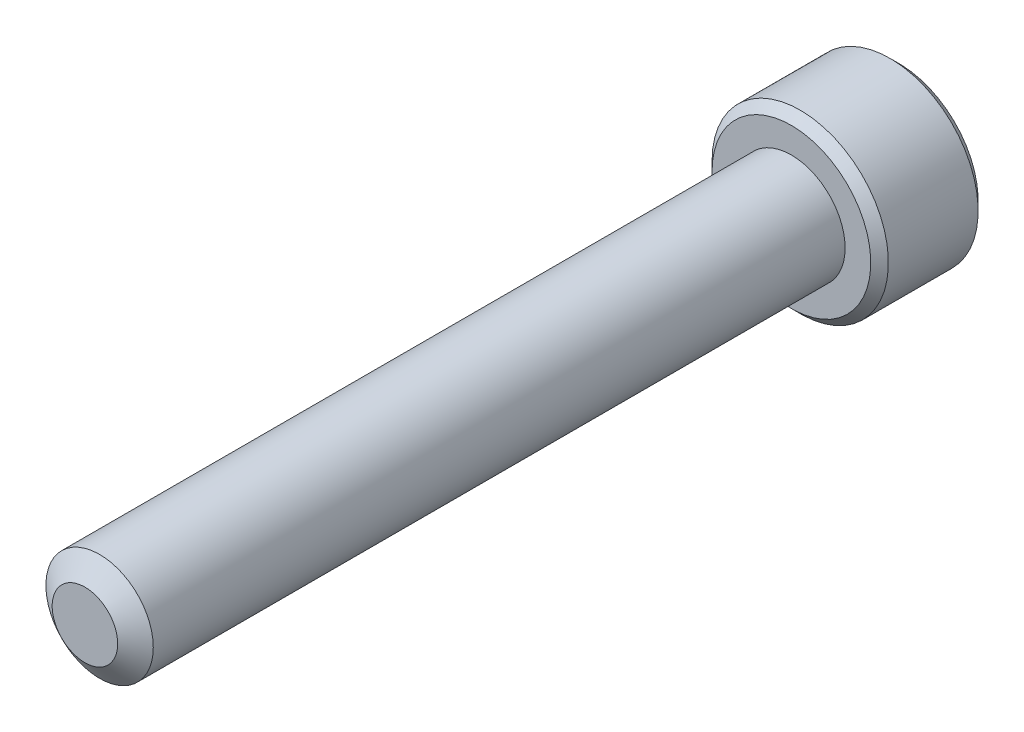
ISO-10303-21;
HEADER;
FILE_DESCRIPTION(('STEP AP214'),'2;1');
FILE_NAME('part.step','',(''),(''),'','','');
FILE_SCHEMA(('AUTOMOTIVE_DESIGN { 1 0 10303 214 1 1 1 1 }'));
ENDSEC;
DATA;
#1=APPLICATION_CONTEXT('core data for automotive mechanical design processes');
#2=APPLICATION_PROTOCOL_DEFINITION('international standard','automotive_design',2000,#1);
#3=PRODUCT_CONTEXT('',#1,'mechanical');
#4=PRODUCT('Part','Part','',(#3));
#5=PRODUCT_RELATED_PRODUCT_CATEGORY('part','',(#4));
#6=PRODUCT_DEFINITION_FORMATION('','',#4);
#7=PRODUCT_DEFINITION_CONTEXT('part definition',#1,'design');
#8=PRODUCT_DEFINITION('design','',#6,#7);
#9=PRODUCT_DEFINITION_SHAPE('','',#8);
#10=(LENGTH_UNIT() NAMED_UNIT(*) SI_UNIT(.MILLI.,.METRE.));
#11=(NAMED_UNIT(*) PLANE_ANGLE_UNIT() SI_UNIT($,.RADIAN.));
#12=(NAMED_UNIT(*) SI_UNIT($,.STERADIAN.) SOLID_ANGLE_UNIT());
#13=UNCERTAINTY_MEASURE_WITH_UNIT(LENGTH_MEASURE(1.E-05),#10,'distance_accuracy_value','');
#14=(GEOMETRIC_REPRESENTATION_CONTEXT(3) GLOBAL_UNCERTAINTY_ASSIGNED_CONTEXT((#13)) GLOBAL_UNIT_ASSIGNED_CONTEXT((#10,
#11,#12)) REPRESENTATION_CONTEXT('',''));
#15=CARTESIAN_POINT('',(0.,0.,0.));
#16=DIRECTION('',(0.,0.,1.));
#17=DIRECTION('',(1.,0.,0.));
#18=AXIS2_PLACEMENT_3D('',#15,#16,#17);
#19=CARTESIAN_POINT('',(0.,0.,-31.7500000000001));
#20=DIRECTION('',(0.,0.,1.));
#21=DIRECTION('',(1.,0.,0.));
#22=AXIS2_PLACEMENT_3D('',#19,#20,#21);
#23=CYLINDRICAL_SURFACE('',#22,2.413);
#24=CARTESIAN_POINT('',(0.,0.,-0.659180743038945));
#25=DIRECTION('',(0.,0.,1.));
#26=DIRECTION('',(1.,0.,0.));
#27=AXIS2_PLACEMENT_3D('',#24,#25,#26);
#28=CIRCLE('',#27,2.413);
#29=CARTESIAN_POINT('',(2.413,0.,-0.659180743038945));
#30=VERTEX_POINT('',#29);
#31=EDGE_CURVE('E114',#30,#30,#28,.T.);
#32=ORIENTED_EDGE('',*,*,#31,.F.);
#33=EDGE_LOOP('',(#32));
#34=FACE_BOUND('',#33,.T.);
#35=CARTESIAN_POINT('',(0.,0.,-31.7500000000001));
#36=DIRECTION('',(0.,0.,-1.));
#37=DIRECTION('',(-1.,0.,0.));
#38=AXIS2_PLACEMENT_3D('',#35,#36,#37);
#39=CIRCLE('',#38,2.413);
#40=CARTESIAN_POINT('',(-2.413,0.,-31.7500000000001));
#41=VERTEX_POINT('',#40);
#42=EDGE_CURVE('E220',#41,#41,#39,.F.);
#43=ORIENTED_EDGE('',*,*,#42,.T.);
#44=EDGE_LOOP('',(#43));
#45=FACE_BOUND('',#44,.T.);
#46=ADVANCED_FACE('F40',(#34,#45),#23,.T.);
#47=CARTESIAN_POINT('',(0.,0.,0.));
#48=DIRECTION('',(0.,0.,-1.));
#49=DIRECTION('',(-1.,0.,0.));
#50=AXIS2_PLACEMENT_3D('',#47,#48,#49);
#51=CONICAL_SURFACE('',#50,1.4715923357461,0.959931088596884);
#52=ORIENTED_EDGE('',*,*,#31,.T.);
#53=EDGE_LOOP('',(#52));
#54=FACE_BOUND('',#53,.T.);
#55=CARTESIAN_POINT('',(0.,0.,0.));
#56=DIRECTION('',(0.,0.,1.));
#57=DIRECTION('',(1.,0.,0.));
#58=AXIS2_PLACEMENT_3D('',#55,#56,#57);
#59=CIRCLE('',#58,1.4715923357461);
#60=CARTESIAN_POINT('',(1.4715923357461,0.,0.));
#61=VERTEX_POINT('',#60);
#62=EDGE_CURVE('E218',#61,#61,#59,.T.);
#63=ORIENTED_EDGE('',*,*,#62,.F.);
#64=EDGE_LOOP('',(#63));
#65=FACE_BOUND('',#64,.T.);
#66=ADVANCED_FACE('F201',(#54,#65),#51,.T.);
#67=CARTESIAN_POINT('',(0.,0.,0.));
#68=DIRECTION('',(0.,0.,1.));
#69=DIRECTION('',(1.,0.,0.));
#70=AXIS2_PLACEMENT_3D('',#67,#68,#69);
#71=PLANE('',#70);
#72=ORIENTED_EDGE('',*,*,#62,.T.);
#73=EDGE_LOOP('',(#72));
#74=FACE_BOUND('',#73,.T.);
#75=ADVANCED_FACE('F198',(#74),#71,.T.);
#76=CARTESIAN_POINT('',(0.,0.,-36.5760000000001));
#77=DIRECTION('',(0.,0.,1.));
#78=DIRECTION('',(1.,0.,0.));
#79=AXIS2_PLACEMENT_3D('',#76,#77,#78);
#80=CYLINDRICAL_SURFACE('',#79,3.9624);
#81=CARTESIAN_POINT('',(0.,0.,-36.17976));
#82=DIRECTION('',(0.,0.,-1.));
#83=DIRECTION('',(-1.,0.,0.));
#84=AXIS2_PLACEMENT_3D('',#81,#82,#83);
#85=CIRCLE('',#84,3.9624);
#86=CARTESIAN_POINT('',(-3.9624,0.,-36.17976));
#87=VERTEX_POINT('',#86);
#88=EDGE_CURVE('E48',#87,#87,#85,.F.);
#89=ORIENTED_EDGE('',*,*,#88,.T.);
#90=EDGE_LOOP('',(#89));
#91=FACE_BOUND('',#90,.T.);
#92=CARTESIAN_POINT('',(0.,0.,-32.14624));
#93=DIRECTION('',(0.,0.,-1.));
#94=DIRECTION('',(-1.,0.,0.));
#95=AXIS2_PLACEMENT_3D('',#92,#93,#94);
#96=CIRCLE('',#95,3.9624);
#97=CARTESIAN_POINT('',(-3.9624,0.,-32.14624));
#98=VERTEX_POINT('',#97);
#99=EDGE_CURVE('E177',#98,#98,#96,.T.);
#100=ORIENTED_EDGE('',*,*,#99,.T.);
#101=EDGE_LOOP('',(#100));
#102=FACE_BOUND('',#101,.T.);
#103=ADVANCED_FACE('F182',(#91,#102),#80,.T.);
#104=CARTESIAN_POINT('',(0.,0.,-36.5760000000001));
#105=DIRECTION('',(0.,0.,-1.));
#106=DIRECTION('',(-1.,0.,0.));
#107=AXIS2_PLACEMENT_3D('',#104,#105,#106);
#108=PLANE('',#107);
#109=CARTESIAN_POINT('',(0.,0.,-36.5760000000001));
#110=DIRECTION('',(0.,0.,-1.));
#111=DIRECTION('',(-1.,0.,0.));
#112=AXIS2_PLACEMENT_3D('',#109,#110,#111);
#113=CIRCLE('',#112,3.56616);
#114=CARTESIAN_POINT('',(-3.56616,0.,-36.5760000000001));
#115=VERTEX_POINT('',#114);
#116=EDGE_CURVE('E113',#115,#115,#113,.T.);
#117=ORIENTED_EDGE('',*,*,#116,.T.);
#118=EDGE_LOOP('',(#117));
#119=FACE_BOUND('',#118,.T.);
#120=CARTESIAN_POINT('',(0.,0.,-36.5760000000001));
#121=DIRECTION('',(0.,0.,-1.));
#122=DIRECTION('',(-1.,0.,0.));
#123=AXIS2_PLACEMENT_3D('',#120,#121,#122);
#124=CIRCLE('',#123,2.29135888084633);
#125=CARTESIAN_POINT('',(-1.98437499999999,1.14567944042317,-36.5760000000001));
#126=VERTEX_POINT('',#125);
#127=CARTESIAN_POINT('',(0.,2.29135888084633,-36.5760000000001));
#128=VERTEX_POINT('',#127);
#129=EDGE_CURVE('E94',#126,#128,#124,.T.);
#130=ORIENTED_EDGE('',*,*,#129,.F.);
#131=CARTESIAN_POINT('',(-1.98437499999998,-1.14567944042315,-36.5760000000001));
#132=VERTEX_POINT('',#131);
#133=EDGE_CURVE('E54',#132,#126,#124,.T.);
#134=ORIENTED_EDGE('',*,*,#133,.F.);
#135=CARTESIAN_POINT('',(0.,-2.29135888084632,-36.5760000000001));
#136=VERTEX_POINT('',#135);
#137=EDGE_CURVE('E280',#136,#132,#124,.T.);
#138=ORIENTED_EDGE('',*,*,#137,.F.);
#139=CARTESIAN_POINT('',(1.98437500000002,-1.14567944042317,-36.5760000000001));
#140=VERTEX_POINT('',#139);
#141=EDGE_CURVE('E61',#140,#136,#124,.T.);
#142=ORIENTED_EDGE('',*,*,#141,.F.);
#143=CARTESIAN_POINT('',(1.98437500000002,1.14567944042317,-36.5760000000001));
#144=VERTEX_POINT('',#143);
#145=EDGE_CURVE('E135',#144,#140,#124,.T.);
#146=ORIENTED_EDGE('',*,*,#145,.F.);
#147=EDGE_CURVE('E103',#128,#144,#124,.T.);
#148=ORIENTED_EDGE('',*,*,#147,.F.);
#149=EDGE_LOOP('',(#130,#134,#138,#142,#146,#148));
#150=FACE_BOUND('',#149,.T.);
#151=ADVANCED_FACE('F134',(#119,#150),#108,.T.);
#152=CARTESIAN_POINT('',(0.,0.,-31.7500000000001));
#153=DIRECTION('',(0.,0.,-1.));
#154=DIRECTION('',(-1.,0.,0.));
#155=AXIS2_PLACEMENT_3D('',#152,#153,#154);
#156=PLANE('',#155);
#157=CARTESIAN_POINT('',(0.,0.,-31.7500000000001));
#158=DIRECTION('',(0.,0.,-1.));
#159=DIRECTION('',(-1.,0.,0.));
#160=AXIS2_PLACEMENT_3D('',#157,#158,#159);
#161=CIRCLE('',#160,3.56616);
#162=CARTESIAN_POINT('',(-3.56616,0.,-31.7500000000001));
#163=VERTEX_POINT('',#162);
#164=EDGE_CURVE('E11',#163,#163,#161,.F.);
#165=ORIENTED_EDGE('',*,*,#164,.T.);
#166=EDGE_LOOP('',(#165));
#167=FACE_BOUND('',#166,.T.);
#168=ORIENTED_EDGE('',*,*,#42,.F.);
#169=EDGE_LOOP('',(#168));
#170=FACE_BOUND('',#169,.T.);
#171=ADVANCED_FACE('F191',(#167,#170),#156,.F.);
#172=CARTESIAN_POINT('',(0.,0.,-36.5760000000001));
#173=DIRECTION('',(0.,0.,-1.));
#174=DIRECTION('',(-1.,0.,0.));
#175=AXIS2_PLACEMENT_3D('',#172,#173,#174);
#176=CONICAL_SURFACE('',#175,2.29135888084633,0.78539816339745);
#177=ORIENTED_EDGE('',*,*,#147,.T.);
#178=CARTESIAN_POINT('',(-0.000199999999998812,2.29147435090017,-36.5761154787818));
#179=CARTESIAN_POINT('',(0.0680159951668253,2.25208982772758,-36.5367628522639));
#180=CARTESIAN_POINT('',(0.137372685106995,2.21204672412052,-36.4997213104462));
#181=CARTESIAN_POINT('',(0.27879880045223,2.13039431835551,-36.4318988584234));
#182=CARTESIAN_POINT('',(0.350881678736831,2.08877724917393,-36.4011556890918));
#183=CARTESIAN_POINT('',(0.496233397266061,2.0048583953539,-36.3484918888113));
#184=CARTESIAN_POINT('',(0.569465212486998,1.96257798712285,-36.3264388758801));
#185=CARTESIAN_POINT('',(0.717541182594748,1.87708628592062,-36.2924614929439));
#186=CARTESIAN_POINT('',(0.792380812753446,1.83387760530244,-36.2805117560916));
#187=CARTESIAN_POINT('',(0.921360414543824,1.7594111974888,-36.2697300990819));
#188=CARTESIAN_POINT('',(0.975333715772452,1.7282496974954,-36.2681338990591));
#189=CARTESIAN_POINT('',(1.08319211851981,1.66597761963485,-36.2708218388654));
#190=CARTESIAN_POINT('',(1.13707718248553,1.63486706344894,-36.2751080403405));
#191=CARTESIAN_POINT('',(1.24433853824862,1.57293969082548,-36.2893168730136));
#192=CARTESIAN_POINT('',(1.29771419276015,1.54212324232507,-36.2992458104523));
#193=CARTESIAN_POINT('',(1.40354251740892,1.48102323060122,-36.3241950842746));
#194=CARTESIAN_POINT('',(1.45599525797112,1.45073962671789,-36.3392150303895));
#195=CARTESIAN_POINT('',(1.59035733896367,1.37316564308797,-36.3838078516357));
#196=CARTESIAN_POINT('',(1.67143335715834,1.32635638215846,-36.4167429959384));
#197=CARTESIAN_POINT('',(1.79064830672984,1.25752759893193,-36.4723424412023));
#198=CARTESIAN_POINT('',(1.829934924386,1.2348454596526,-36.4918775920519));
#199=CARTESIAN_POINT('',(1.90778036186805,1.18990137536715,-36.5327287381194));
#200=CARTESIAN_POINT('',(1.9463396111017,1.16763918244235,-36.5540436395684));
#201=CARTESIAN_POINT('',(1.98457500000001,1.14556397036933,-36.5761154787818));
#202=B_SPLINE_CURVE_WITH_KNOTS('',3,(#178,#179,#180,#181,#182,#183,#184,#185,#186,#187,#188,
#189,#190,#191,#192,#193,#194,#195,#196,#197,#198,#199,#200,#201),.UNSPECIFIED.,.F.,.F.,(4,2,2,
2,2,2,2,2,2,2,2,4),(0.,0.264339630306616,0.530219665093715,0.791876416371474,1.05287424418108,
1.23963984393198,1.4264709174385,1.61351120244033,1.80053715247539,2.09764209964313,
2.2457917987371,2.39385111134151),.UNSPECIFIED.);
#203=EDGE_CURVE('E108',#128,#144,#202,.T.);
#204=ORIENTED_EDGE('',*,*,#203,.F.);
#205=EDGE_LOOP('',(#177,#204));
#206=FACE_BOUND('',#205,.T.);
#207=ADVANCED_FACE('F109',(#206),#176,.F.);
#208=ORIENTED_EDGE('',*,*,#145,.T.);
#209=CARTESIAN_POINT('',(1.98437500000002,-2.28495242157822,-37.3109840788165));
#210=CARTESIAN_POINT('',(1.98437500000002,-2.22931635455398,-37.2689866855508));
#211=CARTESIAN_POINT('',(1.98437500000002,-2.17336876548384,-37.2273960540764));
#212=CARTESIAN_POINT('',(1.98437500000002,-2.06072770258166,-37.1452084614715));
#213=CARTESIAN_POINT('',(1.98437500000002,-2.0040340450343,-37.1046117524051));
#214=CARTESIAN_POINT('',(1.98437500000002,-1.88936329173484,-37.0243035031747));
#215=CARTESIAN_POINT('',(1.98437500000002,-1.83137965519344,-36.9846012588133));
#216=CARTESIAN_POINT('',(1.98437500000002,-1.71442802137836,-36.9066851734013));
#217=CARTESIAN_POINT('',(1.98437500000002,-1.65546009407223,-36.8684712271944));
#218=CARTESIAN_POINT('',(1.98437500000002,-1.4700547230603,-36.7522528340137));
#219=CARTESIAN_POINT('',(1.98437500000002,-1.34163909427878,-36.6773478868724));
#220=CARTESIAN_POINT('',(1.98437500000002,-1.07840384705476,-36.5403302154398));
#221=CARTESIAN_POINT('',(1.98437500000002,-0.94360778140742,-36.4781743664824));
#222=CARTESIAN_POINT('',(1.98437500000002,-0.741275100444877,-36.4021325786887));
#223=CARTESIAN_POINT('',(1.98437500000002,-0.676735408881083,-36.3803080613261));
#224=CARTESIAN_POINT('',(1.98437500000002,-0.546098118112742,-36.3418404635379));
#225=CARTESIAN_POINT('',(1.98437500000002,-0.480000411919937,-36.3251977400656));
#226=CARTESIAN_POINT('',(1.98437500000002,-0.347746170028511,-36.2982353808698));
#227=CARTESIAN_POINT('',(1.98437500000002,-0.281612071479099,-36.287807409736));
#228=CARTESIAN_POINT('',(1.98437500000001,-0.148636620052329,-36.2734781473766));
#229=CARTESIAN_POINT('',(1.98437500000001,-0.0817953907393067,-36.2695757342274));
#230=CARTESIAN_POINT('',(1.98437500000001,0.0495156750890702,-36.2685870513327));
#231=CARTESIAN_POINT('',(1.98437500000002,0.113983775102991,-36.2712591788751));
#232=CARTESIAN_POINT('',(1.98437500000002,0.24236751584617,-36.2827392104976));
#233=CARTESIAN_POINT('',(1.98437500000002,0.306283102295913,-36.2915477106393));
#234=CARTESIAN_POINT('',(1.98437500000002,0.434181040262169,-36.314969021333));
#235=CARTESIAN_POINT('',(1.98437500000002,0.498145026858286,-36.3296806062322));
#236=CARTESIAN_POINT('',(1.98437500000002,0.624675616952993,-36.3641261814122));
#237=CARTESIAN_POINT('',(1.98437500000002,0.687242336899691,-36.3838597514492));
#238=CARTESIAN_POINT('',(1.98437500000002,0.8842254838261,-36.4534122372306));
#239=CARTESIAN_POINT('',(1.98437500000002,1.01583674256463,-36.5111524112565));
#240=CARTESIAN_POINT('',(1.98437500000002,1.27288659242643,-36.6395303365889));
#241=CARTESIAN_POINT('',(1.98437500000002,1.39830088270473,-36.7102144249194));
#242=CARTESIAN_POINT('',(1.98437500000002,1.57956687990216,-36.8205166638132));
#243=CARTESIAN_POINT('',(1.98437500000002,1.63738271299419,-36.8569698294754));
#244=CARTESIAN_POINT('',(1.98437500000002,1.75202215386198,-36.9314159632917));
#245=CARTESIAN_POINT('',(1.98437500000002,1.80884568601358,-36.9694090480781));
#246=CARTESIAN_POINT('',(1.98437500000002,1.92116923084252,-37.0463388088931));
#247=CARTESIAN_POINT('',(1.98437500000002,1.9766762451225,-37.0852653130388));
#248=CARTESIAN_POINT('',(1.98437500000002,2.08693170717164,-37.1641477461214));
#249=CARTESIAN_POINT('',(1.98437500000002,2.14168035934791,-37.204103389024));
#250=CARTESIAN_POINT('',(1.98437500000002,2.19611149046624,-37.2444806112854));
#251=B_SPLINE_CURVE_WITH_KNOTS('',3,(#209,#210,#211,#212,#213,#214,#215,#216,#217,#218,#219,
#220,#221,#222,#223,#224,#225,#226,#227,#228,#229,#230,#231,#232,#233,#234,#235,#236,#237,#238,
#239,#240,#241,#242,#243,#244,#245,#246,#247,#248,#249,#250),.UNSPECIFIED.,.F.,.F.,(4,2,2,2,2,2,
2,2,2,2,2,2,2,2,2,2,2,2,2,2,4),(0.,0.209126070008308,0.418304637356545,0.629103979977967,
0.839888401371164,1.28549951116125,1.72957750768346,1.93379389749965,2.13802435186693,
2.33858179514328,2.53910475350633,2.73236963400787,2.92565329006879,3.12231577097479,
3.31896180041334,3.74886295245158,4.18033428125349,4.38536017180279,4.59040161996374,
4.79377749165099,4.9970974352412),.UNSPECIFIED.);
#252=EDGE_CURVE('E102',#144,#140,#251,.F.);
#253=ORIENTED_EDGE('',*,*,#252,.F.);
#254=EDGE_LOOP('',(#208,#253));
#255=FACE_BOUND('',#254,.T.);
#256=ADVANCED_FACE('F286',(#255),#176,.F.);
#257=ORIENTED_EDGE('',*,*,#141,.T.);
#258=CARTESIAN_POINT('',(1.98457500000001,-1.14556397036933,-36.5761154787818));
#259=CARTESIAN_POINT('',(1.91635900483319,-1.18494849354193,-36.5367628522639));
#260=CARTESIAN_POINT('',(1.84700231489302,-1.22499159714899,-36.4997213104462));
#261=CARTESIAN_POINT('',(1.70557619954779,-1.306644002914,-36.4318988584234));
#262=CARTESIAN_POINT('',(1.63349332126319,-1.34826107209558,-36.4011556890918));
#263=CARTESIAN_POINT('',(1.48814160273396,-1.43217992591561,-36.3484918888113));
#264=CARTESIAN_POINT('',(1.41490978751303,-1.47446033414666,-36.3264388758801));
#265=CARTESIAN_POINT('',(1.26683381740528,-1.55995203534888,-36.2924614929439));
#266=CARTESIAN_POINT('',(1.19199418724658,-1.60316071596706,-36.2805117560916));
#267=CARTESIAN_POINT('',(1.06301458545621,-1.6776271237807,-36.2697300990819));
#268=CARTESIAN_POINT('',(1.00904128422758,-1.7087886237741,-36.2681338990591));
#269=CARTESIAN_POINT('',(0.901182881480227,-1.77106070163465,-36.2708218388654));
#270=CARTESIAN_POINT('',(0.847297817514506,-1.80217125782056,-36.2751080403405));
#271=CARTESIAN_POINT('',(0.740036461751426,-1.86409863044402,-36.2893168730136));
#272=CARTESIAN_POINT('',(0.686660807239889,-1.89491507894443,-36.2992458104523));
#273=CARTESIAN_POINT('',(0.580832482591129,-1.95601509066827,-36.3241950842746));
#274=CARTESIAN_POINT('',(0.528379742028921,-1.98629869455159,-36.3392150303895));
#275=CARTESIAN_POINT('',(0.394017661036372,-2.06387267818152,-36.3838078516357));
#276=CARTESIAN_POINT('',(0.312941642841702,-2.11068193911104,-36.4167429959384));
#277=CARTESIAN_POINT('',(0.193726693270194,-2.17951072233758,-36.4723424412023));
#278=CARTESIAN_POINT('',(0.154440075614036,-2.20219286161691,-36.4918775920519));
#279=CARTESIAN_POINT('',(0.07659463813198,-2.24713694590236,-36.5327287381194));
#280=CARTESIAN_POINT('',(0.0380353888983275,-2.26939913882715,-36.5540436395684));
#281=CARTESIAN_POINT('',(-0.000199999999991873,-2.29147435090016,-36.5761154787818));
#282=B_SPLINE_CURVE_WITH_KNOTS('',3,(#258,#259,#260,#261,#262,#263,#264,#265,#266,#267,#268,
#269,#270,#271,#272,#273,#274,#275,#276,#277,#278,#279,#280,#281),.UNSPECIFIED.,.F.,.F.,(4,2,2,
2,2,2,2,2,2,2,2,4),(0.,0.264339630306613,0.530219665093709,0.791876416371464,1.05287424418106,
1.23963984393196,1.42647091743847,1.6135112024403,1.80053715247536,2.09764209964311,
2.24579179873708,2.3938511113415),.UNSPECIFIED.);
#283=EDGE_CURVE('E145',#140,#136,#282,.T.);
#284=ORIENTED_EDGE('',*,*,#283,.F.);
#285=EDGE_LOOP('',(#257,#284));
#286=FACE_BOUND('',#285,.T.);
#287=ADVANCED_FACE('F283',(#286),#176,.F.);
#288=ORIENTED_EDGE('',*,*,#137,.T.);
#289=CARTESIAN_POINT('',(0.00020000000001269,-2.29147435090017,-36.5761154787818));
#290=CARTESIAN_POINT('',(-0.0680159951668031,-2.25208982772757,-36.5367628522639));
#291=CARTESIAN_POINT('',(-0.137372685106969,-2.21204672412051,-36.4997213104462));
#292=CARTESIAN_POINT('',(-0.2787988004522,-2.13039431835549,-36.4318988584234));
#293=CARTESIAN_POINT('',(-0.350881678736802,-2.08877724917392,-36.4011556890918));
#294=CARTESIAN_POINT('',(-0.496233397266031,-2.00485839535389,-36.3484918888113));
#295=CARTESIAN_POINT('',(-0.569465212486967,-1.96257798712284,-36.32643887588));
#296=CARTESIAN_POINT('',(-0.717541182594717,-1.87708628592061,-36.2924614929439));
#297=CARTESIAN_POINT('',(-0.792380812753418,-1.83387760530243,-36.2805117560916));
#298=CARTESIAN_POINT('',(-0.921360414543798,-1.75941119748879,-36.2697300990819));
#299=CARTESIAN_POINT('',(-0.975333715772427,-1.72824969749539,-36.2681338990591));
#300=CARTESIAN_POINT('',(-1.08319211851979,-1.66597761963484,-36.2708218388654));
#301=CARTESIAN_POINT('',(-1.13707718248551,-1.63486706344893,-36.2751080403405));
#302=CARTESIAN_POINT('',(-1.24433853824859,-1.57293969082547,-36.2893168730136));
#303=CARTESIAN_POINT('',(-1.29771419276013,-1.54212324232506,-36.2992458104523));
#304=CARTESIAN_POINT('',(-1.4035425174089,-1.48102323060121,-36.3241950842746));
#305=CARTESIAN_POINT('',(-1.4559952579711,-1.45073962671788,-36.3392150303895));
#306=CARTESIAN_POINT('',(-1.59035733896365,-1.37316564308796,-36.3838078516357));
#307=CARTESIAN_POINT('',(-1.67143335715832,-1.32635638215844,-36.4167429959384));
#308=CARTESIAN_POINT('',(-1.79064830672982,-1.25752759893191,-36.4723424412022));
#309=CARTESIAN_POINT('',(-1.82993492438598,-1.23484545965257,-36.4918775920519));
#310=CARTESIAN_POINT('',(-1.90778036186803,-1.18990137536713,-36.5327287381194));
#311=CARTESIAN_POINT('',(-1.94633961110168,-1.16763918244233,-36.5540436395684));
#312=CARTESIAN_POINT('',(-1.984575,-1.14556397036933,-36.5761154787818));
#313=B_SPLINE_CURVE_WITH_KNOTS('',3,(#289,#290,#291,#292,#293,#294,#295,#296,#297,#298,#299,
#300,#301,#302,#303,#304,#305,#306,#307,#308,#309,#310,#311,#312),.UNSPECIFIED.,.F.,.F.,(4,2,2,
2,2,2,2,2,2,2,2,4),(0.,0.264339630306617,0.530219665093717,0.791876416371473,1.05287424418108,
1.23963984393198,1.42647091743851,1.61351120244034,1.8005371524754,2.09764209964315,
2.24579179873711,2.39385111134153),.UNSPECIFIED.);
#314=EDGE_CURVE('E257',#136,#132,#313,.T.);
#315=ORIENTED_EDGE('',*,*,#314,.F.);
#316=EDGE_LOOP('',(#288,#315));
#317=FACE_BOUND('',#316,.T.);
#318=ADVANCED_FACE('F282',(#317),#176,.F.);
#319=ORIENTED_EDGE('',*,*,#133,.T.);
#320=CARTESIAN_POINT('',(-1.98437499999999,-2.28495242191067,-37.3109840790676));
#321=CARTESIAN_POINT('',(-1.98437499999999,-2.22931635487714,-37.2689866857922));
#322=CARTESIAN_POINT('',(-1.98437499999998,-2.17336876579766,-37.2273960543081));
#323=CARTESIAN_POINT('',(-1.98437499999998,-2.06072770287667,-37.145208461684));
#324=CARTESIAN_POINT('',(-1.98437499999998,-2.00403404531986,-37.1046117526079));
#325=CARTESIAN_POINT('',(-1.98437499999998,-1.88936329200117,-37.0243035033583));
#326=CARTESIAN_POINT('',(-1.98437499999998,-1.83137965544999,-36.9846012589873));
#327=CARTESIAN_POINT('',(-1.98437499999998,-1.71442802161519,-36.9066851735561));
#328=CARTESIAN_POINT('',(-1.98437499999998,-1.65546009429911,-36.8684712273396));
#329=CARTESIAN_POINT('',(-1.98437499999998,-1.47005472325434,-36.7522528341287));
#330=CARTESIAN_POINT('',(-1.98437499999998,-1.34163909444946,-36.6773478869673));
#331=CARTESIAN_POINT('',(-1.98437499999999,-1.07840384717676,-36.5403302154972));
#332=CARTESIAN_POINT('',(-1.984375,-0.9436077815041,-36.4781743665225));
#333=CARTESIAN_POINT('',(-1.98437499999999,-0.741275100522498,-36.402132578716));
#334=CARTESIAN_POINT('',(-1.98437499999998,-0.676735408966677,-36.3803080613539));
#335=CARTESIAN_POINT('',(-1.98437499999998,-0.546098118214548,-36.3418404635651));
#336=CARTESIAN_POINT('',(-1.98437499999998,-0.480000412029982,-36.3251977400917));
#337=CARTESIAN_POINT('',(-1.98437499999998,-0.347746170154761,-36.2982353808918));
#338=CARTESIAN_POINT('',(-1.98437499999998,-0.281612071613312,-36.2878074097551));
#339=CARTESIAN_POINT('',(-1.98437499999999,-0.1486366202022,-36.2734781473881));
#340=CARTESIAN_POINT('',(-1.984375,-0.0817953908968734,-36.2695757342341));
#341=CARTESIAN_POINT('',(-1.984375,0.0495156749173087,-36.2685870513286));
#342=CARTESIAN_POINT('',(-1.98437499999999,0.11398377492471,-36.271259178865));
#343=CARTESIAN_POINT('',(-1.98437499999998,0.2423675156555,-36.2827392104746));
#344=CARTESIAN_POINT('',(-1.98437499999998,0.306283102099373,-36.2915477106094));
#345=CARTESIAN_POINT('',(-1.98437499999998,0.43418104005405,-36.3149690212886));
#346=CARTESIAN_POINT('',(-1.98437499999998,0.498145026644476,-36.3296806061801));
#347=CARTESIAN_POINT('',(-1.98437499999998,0.624675616728325,-36.3641261813448));
#348=CARTESIAN_POINT('',(-1.98437499999999,0.687242336669858,-36.383859751374));
#349=CARTESIAN_POINT('',(-1.98437499999999,0.884225483546212,-36.4534122371189));
#350=CARTESIAN_POINT('',(-1.98437499999998,1.01583674224242,-36.5111524111108));
#351=CARTESIAN_POINT('',(-1.98437499999998,1.27288659202273,-36.6395303363718));
#352=CARTESIAN_POINT('',(-1.98437499999998,1.3983008822619,-36.7102144246649));
#353=CARTESIAN_POINT('',(-1.98437499999998,1.57956687940504,-36.8205166635037));
#354=CARTESIAN_POINT('',(-1.98437499999998,1.63738271248118,-36.8569698291489));
#355=CARTESIAN_POINT('',(-1.98437499999998,1.75202215331742,-36.9314159629313));
#356=CARTESIAN_POINT('',(-1.98437499999998,1.80884568545336,-36.9694090477007));
#357=CARTESIAN_POINT('',(-1.98437499999998,1.92116923025135,-37.0463388084819));
#358=CARTESIAN_POINT('',(-1.98437499999998,1.97667624451605,-37.0852653126108));
#359=CARTESIAN_POINT('',(-1.98437499999998,2.08693170653472,-37.1641477456598));
#360=CARTESIAN_POINT('',(-1.98437499999999,2.1416803586958,-37.2041033885457));
#361=CARTESIAN_POINT('',(-1.984375,2.19611148979895,-37.2444806107903));
#362=B_SPLINE_CURVE_WITH_KNOTS('',3,(#320,#321,#322,#323,#324,#325,#326,#327,#328,#329,#330,
#331,#332,#333,#334,#335,#336,#337,#338,#339,#340,#341,#342,#343,#344,#345,#346,#347,#348,#349,
#350,#351,#352,#353,#354,#355,#356,#357,#358,#359,#360,#361),.UNSPECIFIED.,.F.,.F.,(4,2,2,2,2,2,
2,2,2,2,2,2,2,2,2,2,2,2,2,2,4),(0.,0.209126070048123,0.418304637436186,0.629103980098187,
0.839888401531941,1.28549951141303,1.72957750802538,1.93379389781851,2.13802435216276,
2.33858179541703,2.53910475375799,2.73236963423932,2.92565329028001,3.12231577116424,
3.31896180058105,3.74886295246283,4.18033428110721,4.38536017158911,4.59040161968264,
4.79377749130341,4.99709743482717),.UNSPECIFIED.);
#363=EDGE_CURVE('E124',#132,#126,#362,.T.);
#364=ORIENTED_EDGE('',*,*,#363,.F.);
#365=EDGE_LOOP('',(#319,#364));
#366=FACE_BOUND('',#365,.T.);
#367=ADVANCED_FACE('F295',(#366),#176,.F.);
#368=ORIENTED_EDGE('',*,*,#129,.T.);
#369=CARTESIAN_POINT('',(-1.984575,1.14556397036933,-36.5761154787818));
#370=CARTESIAN_POINT('',(-1.91635900483318,1.18494849354193,-36.5367628522639));
#371=CARTESIAN_POINT('',(-1.84700231489301,1.22499159714898,-36.4997213104462));
#372=CARTESIAN_POINT('',(-1.70557619954777,1.306644002914,-36.4318988584234));
#373=CARTESIAN_POINT('',(-1.63349332126317,1.34826107209558,-36.4011556890918));
#374=CARTESIAN_POINT('',(-1.48814160273394,1.4321799259156,-36.3484918888113));
#375=CARTESIAN_POINT('',(-1.41490978751301,1.47446033414665,-36.32643887588));
#376=CARTESIAN_POINT('',(-1.26683381740525,1.55995203534888,-36.2924614929439));
#377=CARTESIAN_POINT('',(-1.19199418724655,1.60316071596706,-36.2805117560916));
#378=CARTESIAN_POINT('',(-1.06301458545617,1.6776271237807,-36.2697300990819));
#379=CARTESIAN_POINT('',(-1.00904128422755,1.7087886237741,-36.2681338990591));
#380=CARTESIAN_POINT('',(-0.901182881480188,1.77106070163466,-36.2708218388654));
#381=CARTESIAN_POINT('',(-0.847297817514464,1.80217125782057,-36.2751080403405));
#382=CARTESIAN_POINT('',(-0.740036461751381,1.86409863044403,-36.2893168730136));
#383=CARTESIAN_POINT('',(-0.686660807239843,1.89491507894444,-36.2992458104523));
#384=CARTESIAN_POINT('',(-0.580832482591082,1.95601509066828,-36.3241950842746));
#385=CARTESIAN_POINT('',(-0.528379742028873,1.98629869455161,-36.3392150303895));
#386=CARTESIAN_POINT('',(-0.39401766103633,2.06387267818153,-36.3838078516357));
#387=CARTESIAN_POINT('',(-0.312941642841665,2.11068193911104,-36.4167429959384));
#388=CARTESIAN_POINT('',(-0.193726693270164,2.17951072233758,-36.4723424412023));
#389=CARTESIAN_POINT('',(-0.154440075614007,2.20219286161691,-36.4918775920519));
#390=CARTESIAN_POINT('',(-0.0765946381319593,2.24713694590236,-36.5327287381194));
#391=CARTESIAN_POINT('',(-0.0380353888983118,2.26939913882716,-36.5540436395684));
#392=CARTESIAN_POINT('',(0.000199999999998812,2.29147435090017,-36.5761154787818));
#393=B_SPLINE_CURVE_WITH_KNOTS('',3,(#369,#370,#371,#372,#373,#374,#375,#376,#377,#378,#379,
#380,#381,#382,#383,#384,#385,#386,#387,#388,#389,#390,#391,#392),.UNSPECIFIED.,.F.,.F.,(4,2,2,
2,2,2,2,2,2,2,2,4),(0.,0.264339630306622,0.530219665093719,0.791876416371477,1.05287424418108,
1.23963984393199,1.42647091743851,1.61351120244034,1.8005371524754,2.09764209964314,
2.2457917987371,2.39385111134151),.UNSPECIFIED.);
#394=EDGE_CURVE('E98',#126,#128,#393,.T.);
#395=ORIENTED_EDGE('',*,*,#394,.F.);
#396=EDGE_LOOP('',(#368,#395));
#397=FACE_BOUND('',#396,.T.);
#398=ADVANCED_FACE('F96',(#397),#176,.F.);
#399=CARTESIAN_POINT('',(0.,2.29135888084633,-33.5994375000001));
#400=DIRECTION('',(0.,0.,-1.));
#401=DIRECTION('',(-1.,0.,0.));
#402=AXIS2_PLACEMENT_3D('',#399,#400,#401);
#403=PLANE('',#402);
#404=DIRECTION('',(0.866025403784438,0.5,0.));
#405=VECTOR('',#404,1.);
#406=CARTESIAN_POINT('',(-1.98437499999999,1.14567944042317,-33.5994375000001));
#407=LINE('',#406,#405);
#408=CARTESIAN_POINT('',(-1.98437499999999,1.14567944042317,-33.5994375000001));
#409=VERTEX_POINT('',#408);
#410=CARTESIAN_POINT('',(0.,2.29135888084633,-33.5994375000001));
#411=VERTEX_POINT('',#410);
#412=EDGE_CURVE('E123',#409,#411,#407,.T.);
#413=ORIENTED_EDGE('',*,*,#412,.T.);
#414=DIRECTION('',(0.866025403784439,-0.500000000000001,0.));
#415=VECTOR('',#414,1.);
#416=CARTESIAN_POINT('',(0.,2.29135888084633,-33.5994375000001));
#417=LINE('',#416,#415);
#418=CARTESIAN_POINT('',(1.98437500000002,1.14567944042317,-33.5994375000001));
#419=VERTEX_POINT('',#418);
#420=EDGE_CURVE('E128',#411,#419,#417,.T.);
#421=ORIENTED_EDGE('',*,*,#420,.T.);
#422=DIRECTION('',(0.,-1.,0.));
#423=VECTOR('',#422,1.);
#424=CARTESIAN_POINT('',(1.98437500000002,1.14567944042317,-33.5994375000001));
#425=LINE('',#424,#423);
#426=CARTESIAN_POINT('',(1.98437500000002,-1.14567944042317,-33.5994375000001));
#427=VERTEX_POINT('',#426);
#428=EDGE_CURVE('E243',#419,#427,#425,.T.);
#429=ORIENTED_EDGE('',*,*,#428,.T.);
#430=DIRECTION('',(-0.866025403784438,-0.5,0.));
#431=VECTOR('',#430,1.);
#432=CARTESIAN_POINT('',(1.98437500000002,-1.14567944042317,-33.5994375000001));
#433=LINE('',#432,#431);
#434=CARTESIAN_POINT('',(0.,-2.29135888084632,-33.5994375000001));
#435=VERTEX_POINT('',#434);
#436=EDGE_CURVE('E240',#427,#435,#433,.T.);
#437=ORIENTED_EDGE('',*,*,#436,.T.);
#438=DIRECTION('',(-0.866025403784439,0.500000000000001,0.));
#439=VECTOR('',#438,1.);
#440=CARTESIAN_POINT('',(0.,-2.29135888084632,-33.5994375000001));
#441=LINE('',#440,#439);
#442=CARTESIAN_POINT('',(-1.98437499999998,-1.14567944042315,-33.5994375000001));
#443=VERTEX_POINT('',#442);
#444=EDGE_CURVE('E237',#435,#443,#441,.T.);
#445=ORIENTED_EDGE('',*,*,#444,.T.);
#446=DIRECTION('',(0.,1.,0.));
#447=VECTOR('',#446,1.);
#448=CARTESIAN_POINT('',(-1.98437499999998,-1.14567944042315,-33.5994375000001));
#449=LINE('',#448,#447);
#450=EDGE_CURVE('E131',#443,#409,#449,.T.);
#451=ORIENTED_EDGE('',*,*,#450,.T.);
#452=EDGE_LOOP('',(#413,#421,#429,#437,#445,#451));
#453=FACE_BOUND('',#452,.T.);
#454=ADVANCED_FACE('F165',(#453),#403,.T.);
#455=CARTESIAN_POINT('',(0.,2.29135888084633,-33.5994375000001));
#456=DIRECTION('',(0.5,0.866025403784439,0.));
#457=DIRECTION('',(-0.866025403784439,0.500000000000001,0.));
#458=AXIS2_PLACEMENT_3D('',#455,#456,#457);
#459=PLANE('',#458);
#460=DIRECTION('',(0.,0.,-1.));
#461=VECTOR('',#460,1.);
#462=CARTESIAN_POINT('',(0.,2.29135888084633,-33.5994375000001));
#463=LINE('',#462,#461);
#464=EDGE_CURVE('E120',#411,#128,#463,.T.);
#465=ORIENTED_EDGE('',*,*,#464,.T.);
#466=ORIENTED_EDGE('',*,*,#203,.T.);
#467=DIRECTION('',(0.,0.,-1.));
#468=VECTOR('',#467,1.);
#469=CARTESIAN_POINT('',(1.98437500000002,1.14567944042317,-33.5994375000001));
#470=LINE('',#469,#468);
#471=EDGE_CURVE('E130',#419,#144,#470,.T.);
#472=ORIENTED_EDGE('',*,*,#471,.F.);
#473=ORIENTED_EDGE('',*,*,#420,.F.);
#474=EDGE_LOOP('',(#465,#466,#472,#473));
#475=FACE_BOUND('',#474,.T.);
#476=ADVANCED_FACE('F126',(#475),#459,.F.);
#477=CARTESIAN_POINT('',(1.98437500000002,1.14567944042317,-33.5994375000001));
#478=DIRECTION('',(1.,0.,0.));
#479=DIRECTION('',(0.,0.,-1.));
#480=AXIS2_PLACEMENT_3D('',#477,#478,#479);
#481=PLANE('',#480);
#482=ORIENTED_EDGE('',*,*,#471,.T.);
#483=ORIENTED_EDGE('',*,*,#252,.T.);
#484=DIRECTION('',(0.,0.,-1.));
#485=VECTOR('',#484,1.);
#486=CARTESIAN_POINT('',(1.98437500000002,-1.14567944042317,-33.5994375000001));
#487=LINE('',#486,#485);
#488=EDGE_CURVE('E226',#427,#140,#487,.T.);
#489=ORIENTED_EDGE('',*,*,#488,.F.);
#490=ORIENTED_EDGE('',*,*,#428,.F.);
#491=EDGE_LOOP('',(#482,#483,#489,#490));
#492=FACE_BOUND('',#491,.T.);
#493=ADVANCED_FACE('F154',(#492),#481,.F.);
#494=CARTESIAN_POINT('',(1.98437500000002,-1.14567944042317,-33.5994375000001));
#495=DIRECTION('',(0.5,-0.86602540378444,0.));
#496=DIRECTION('',(0.866025403784438,0.5,0.));
#497=AXIS2_PLACEMENT_3D('',#494,#495,#496);
#498=PLANE('',#497);
#499=ORIENTED_EDGE('',*,*,#488,.T.);
#500=ORIENTED_EDGE('',*,*,#283,.T.);
#501=DIRECTION('',(0.,0.,-1.));
#502=VECTOR('',#501,1.);
#503=CARTESIAN_POINT('',(0.,-2.29135888084632,-33.5994375000001));
#504=LINE('',#503,#502);
#505=EDGE_CURVE('E229',#435,#136,#504,.T.);
#506=ORIENTED_EDGE('',*,*,#505,.F.);
#507=ORIENTED_EDGE('',*,*,#436,.F.);
#508=EDGE_LOOP('',(#499,#500,#506,#507));
#509=FACE_BOUND('',#508,.T.);
#510=ADVANCED_FACE('F158',(#509),#498,.F.);
#511=CARTESIAN_POINT('',(0.,-2.29135888084632,-33.5994375000001));
#512=DIRECTION('',(-0.499999999999999,-0.866025403784439,0.));
#513=DIRECTION('',(0.866025403784439,-0.500000000000001,0.));
#514=AXIS2_PLACEMENT_3D('',#511,#512,#513);
#515=PLANE('',#514);
#516=ORIENTED_EDGE('',*,*,#505,.T.);
#517=ORIENTED_EDGE('',*,*,#314,.T.);
#518=DIRECTION('',(0.,0.,-1.));
#519=VECTOR('',#518,1.);
#520=CARTESIAN_POINT('',(-1.98437499999998,-1.14567944042315,-33.5994375000001));
#521=LINE('',#520,#519);
#522=EDGE_CURVE('E232',#443,#132,#521,.T.);
#523=ORIENTED_EDGE('',*,*,#522,.F.);
#524=ORIENTED_EDGE('',*,*,#444,.F.);
#525=EDGE_LOOP('',(#516,#517,#523,#524));
#526=FACE_BOUND('',#525,.T.);
#527=ADVANCED_FACE('F265',(#526),#515,.F.);
#528=CARTESIAN_POINT('',(-1.98437499999998,-1.14567944042315,-33.5994375000001));
#529=DIRECTION('',(-1.,0.,0.));
#530=DIRECTION('',(0.,-1.,0.));
#531=AXIS2_PLACEMENT_3D('',#528,#529,#530);
#532=PLANE('',#531);
#533=ORIENTED_EDGE('',*,*,#522,.T.);
#534=ORIENTED_EDGE('',*,*,#363,.T.);
#535=DIRECTION('',(0.,0.,-1.));
#536=VECTOR('',#535,1.);
#537=CARTESIAN_POINT('',(-1.98437499999999,1.14567944042317,-33.5994375000001));
#538=LINE('',#537,#536);
#539=EDGE_CURVE('E122',#409,#126,#538,.T.);
#540=ORIENTED_EDGE('',*,*,#539,.F.);
#541=ORIENTED_EDGE('',*,*,#450,.F.);
#542=EDGE_LOOP('',(#533,#534,#540,#541));
#543=FACE_BOUND('',#542,.T.);
#544=ADVANCED_FACE('F262',(#543),#532,.F.);
#545=CARTESIAN_POINT('',(-1.98437499999999,1.14567944042317,-33.5994375000001));
#546=DIRECTION('',(-0.5,0.86602540378444,0.));
#547=DIRECTION('',(-0.866025403784438,-0.5,0.));
#548=AXIS2_PLACEMENT_3D('',#545,#546,#547);
#549=PLANE('',#548);
#550=ORIENTED_EDGE('',*,*,#539,.T.);
#551=ORIENTED_EDGE('',*,*,#394,.T.);
#552=ORIENTED_EDGE('',*,*,#464,.F.);
#553=ORIENTED_EDGE('',*,*,#412,.F.);
#554=EDGE_LOOP('',(#550,#551,#552,#553));
#555=FACE_BOUND('',#554,.T.);
#556=ADVANCED_FACE('F118',(#555),#549,.F.);
#557=CARTESIAN_POINT('',(0.,0.,-36.5760000000001));
#558=DIRECTION('',(0.,0.,1.));
#559=DIRECTION('',(1.,0.,0.));
#560=AXIS2_PLACEMENT_3D('',#557,#558,#559);
#561=CONICAL_SURFACE('',#560,3.56616,0.785398163397437);
#562=ORIENTED_EDGE('',*,*,#88,.F.);
#563=EDGE_LOOP('',(#562));
#564=FACE_BOUND('',#563,.T.);
#565=ORIENTED_EDGE('',*,*,#116,.F.);
#566=EDGE_LOOP('',(#565));
#567=FACE_BOUND('',#566,.T.);
#568=ADVANCED_FACE('F185',(#564,#567),#561,.T.);
#569=CARTESIAN_POINT('',(0.,0.,-32.14624));
#570=DIRECTION('',(0.,0.,-1.));
#571=DIRECTION('',(-1.,0.,0.));
#572=AXIS2_PLACEMENT_3D('',#569,#570,#571);
#573=CONICAL_SURFACE('',#572,3.9624,0.78539816339745);
#574=ORIENTED_EDGE('',*,*,#164,.F.);
#575=EDGE_LOOP('',(#574));
#576=FACE_BOUND('',#575,.T.);
#577=ORIENTED_EDGE('',*,*,#99,.F.);
#578=EDGE_LOOP('',(#577));
#579=FACE_BOUND('',#578,.T.);
#580=ADVANCED_FACE('F42',(#576,#579),#573,.T.);
#581=CLOSED_SHELL('',(#46,#66,#75,#103,#151,#171,#207,#256,#287,#318,#367,#398,#454,#476,#493,
#510,#527,#544,#556,#568,#580));
#582=MANIFOLD_SOLID_BREP('B2',#581);
#583=ADVANCED_BREP_SHAPE_REPRESENTATION('',(#18,#582),#14);
#584=SHAPE_DEFINITION_REPRESENTATION(#9,#583);
ENDSEC;
END-ISO-10303-21;
